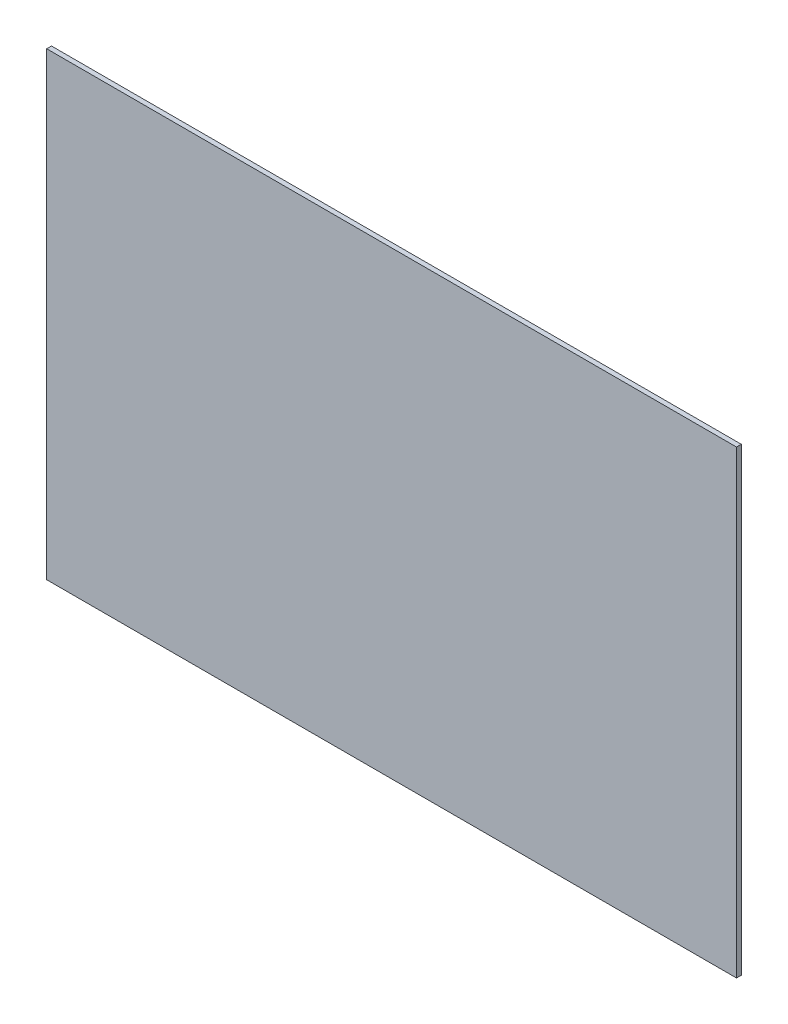
ISO-10303-21;
HEADER;
FILE_DESCRIPTION(('STEP AP214'),'2;1');
FILE_NAME('part.step','',(''),(''),'','','');
FILE_SCHEMA(('AUTOMOTIVE_DESIGN { 1 0 10303 214 1 1 1 1 }'));
ENDSEC;
DATA;
#1=APPLICATION_CONTEXT('core data for automotive mechanical design processes');
#2=APPLICATION_PROTOCOL_DEFINITION('international standard','automotive_design',2000,#1);
#3=PRODUCT_CONTEXT('',#1,'mechanical');
#4=PRODUCT('Part','Part','',(#3));
#5=PRODUCT_RELATED_PRODUCT_CATEGORY('part','',(#4));
#6=PRODUCT_DEFINITION_FORMATION('','',#4);
#7=PRODUCT_DEFINITION_CONTEXT('part definition',#1,'design');
#8=PRODUCT_DEFINITION('design','',#6,#7);
#9=PRODUCT_DEFINITION_SHAPE('','',#8);
#10=(LENGTH_UNIT() NAMED_UNIT(*) SI_UNIT(.MILLI.,.METRE.));
#11=(NAMED_UNIT(*) PLANE_ANGLE_UNIT() SI_UNIT($,.RADIAN.));
#12=(NAMED_UNIT(*) SI_UNIT($,.STERADIAN.) SOLID_ANGLE_UNIT());
#13=UNCERTAINTY_MEASURE_WITH_UNIT(LENGTH_MEASURE(1.E-05),#10,'distance_accuracy_value','');
#14=(GEOMETRIC_REPRESENTATION_CONTEXT(3) GLOBAL_UNCERTAINTY_ASSIGNED_CONTEXT((#13)) GLOBAL_UNIT_ASSIGNED_CONTEXT((#10,
#11,#12)) REPRESENTATION_CONTEXT('',''));
#15=CARTESIAN_POINT('',(0.,0.,0.));
#16=DIRECTION('',(0.,0.,1.));
#17=DIRECTION('',(1.,0.,0.));
#18=AXIS2_PLACEMENT_3D('',#15,#16,#17);
#19=CARTESIAN_POINT('',(457.2,304.8,6.35));
#20=DIRECTION('',(-1.,0.,0.));
#21=DIRECTION('',(0.,-1.,0.));
#22=AXIS2_PLACEMENT_3D('',#19,#20,#21);
#23=PLANE('',#22);
#24=DIRECTION('',(0.,1.,0.));
#25=VECTOR('',#24,1.);
#26=CARTESIAN_POINT('',(457.2,304.8,0.));
#27=LINE('',#26,#25);
#28=CARTESIAN_POINT('',(457.2,-304.8,0.));
#29=VERTEX_POINT('',#28);
#30=CARTESIAN_POINT('',(457.2,304.8,0.));
#31=VERTEX_POINT('',#30);
#32=EDGE_CURVE('E102',#29,#31,#27,.T.);
#33=ORIENTED_EDGE('',*,*,#32,.T.);
#34=DIRECTION('',(0.,0.,-1.));
#35=VECTOR('',#34,1.);
#36=CARTESIAN_POINT('',(457.2,304.8,6.35));
#37=LINE('',#36,#35);
#38=CARTESIAN_POINT('',(457.2,304.8,6.35));
#39=VERTEX_POINT('',#38);
#40=EDGE_CURVE('E11',#39,#31,#37,.T.);
#41=ORIENTED_EDGE('',*,*,#40,.F.);
#42=DIRECTION('',(0.,1.,0.));
#43=VECTOR('',#42,1.);
#44=CARTESIAN_POINT('',(457.2,304.8,6.35));
#45=LINE('',#44,#43);
#46=CARTESIAN_POINT('',(457.2,-304.8,6.35));
#47=VERTEX_POINT('',#46);
#48=EDGE_CURVE('E90',#47,#39,#45,.T.);
#49=ORIENTED_EDGE('',*,*,#48,.F.);
#50=DIRECTION('',(0.,0.,-1.));
#51=VECTOR('',#50,1.);
#52=CARTESIAN_POINT('',(457.2,-304.8,6.35));
#53=LINE('',#52,#51);
#54=EDGE_CURVE('E98',#47,#29,#53,.T.);
#55=ORIENTED_EDGE('',*,*,#54,.T.);
#56=EDGE_LOOP('',(#33,#41,#49,#55));
#57=FACE_BOUND('',#56,.T.);
#58=ADVANCED_FACE('F39',(#57),#23,.F.);
#59=CARTESIAN_POINT('',(-457.2,304.8,6.35));
#60=DIRECTION('',(0.,-1.,0.));
#61=DIRECTION('',(0.,0.,-1.));
#62=AXIS2_PLACEMENT_3D('',#59,#60,#61);
#63=PLANE('',#62);
#64=DIRECTION('',(-1.,0.,0.));
#65=VECTOR('',#64,1.);
#66=CARTESIAN_POINT('',(-457.2,304.8,0.));
#67=LINE('',#66,#65);
#68=CARTESIAN_POINT('',(-457.2,304.8,0.));
#69=VERTEX_POINT('',#68);
#70=EDGE_CURVE('E94',#31,#69,#67,.T.);
#71=ORIENTED_EDGE('',*,*,#70,.T.);
#72=DIRECTION('',(0.,0.,-1.));
#73=VECTOR('',#72,1.);
#74=CARTESIAN_POINT('',(-457.2,304.8,6.35));
#75=LINE('',#74,#73);
#76=CARTESIAN_POINT('',(-457.2,304.8,6.35));
#77=VERTEX_POINT('',#76);
#78=EDGE_CURVE('E47',#77,#69,#75,.T.);
#79=ORIENTED_EDGE('',*,*,#78,.F.);
#80=DIRECTION('',(-1.,0.,0.));
#81=VECTOR('',#80,1.);
#82=CARTESIAN_POINT('',(-457.2,304.8,6.35));
#83=LINE('',#82,#81);
#84=EDGE_CURVE('E85',#39,#77,#83,.T.);
#85=ORIENTED_EDGE('',*,*,#84,.F.);
#86=ORIENTED_EDGE('',*,*,#40,.T.);
#87=EDGE_LOOP('',(#71,#79,#85,#86));
#88=FACE_BOUND('',#87,.T.);
#89=ADVANCED_FACE('F93',(#88),#63,.F.);
#90=CARTESIAN_POINT('',(-457.2,304.8,6.35));
#91=DIRECTION('',(1.,0.,0.));
#92=DIRECTION('',(0.,1.,0.));
#93=AXIS2_PLACEMENT_3D('',#90,#91,#92);
#94=PLANE('',#93);
#95=DIRECTION('',(0.,-1.,0.));
#96=VECTOR('',#95,1.);
#97=CARTESIAN_POINT('',(-457.2,304.8,0.));
#98=LINE('',#97,#96);
#99=CARTESIAN_POINT('',(-457.2,-304.8,0.));
#100=VERTEX_POINT('',#99);
#101=EDGE_CURVE('E72',#69,#100,#98,.T.);
#102=ORIENTED_EDGE('',*,*,#101,.T.);
#103=DIRECTION('',(0.,0.,-1.));
#104=VECTOR('',#103,1.);
#105=CARTESIAN_POINT('',(-457.2,-304.8,6.35));
#106=LINE('',#105,#104);
#107=CARTESIAN_POINT('',(-457.2,-304.8,6.35));
#108=VERTEX_POINT('',#107);
#109=EDGE_CURVE('E95',#108,#100,#106,.T.);
#110=ORIENTED_EDGE('',*,*,#109,.F.);
#111=DIRECTION('',(0.,-1.,0.));
#112=VECTOR('',#111,1.);
#113=CARTESIAN_POINT('',(-457.2,304.8,6.35));
#114=LINE('',#113,#112);
#115=EDGE_CURVE('E88',#77,#108,#114,.T.);
#116=ORIENTED_EDGE('',*,*,#115,.F.);
#117=ORIENTED_EDGE('',*,*,#78,.T.);
#118=EDGE_LOOP('',(#102,#110,#116,#117));
#119=FACE_BOUND('',#118,.T.);
#120=ADVANCED_FACE('F96',(#119),#94,.F.);
#121=CARTESIAN_POINT('',(-457.2,-304.8,6.35));
#122=DIRECTION('',(0.,1.,0.));
#123=DIRECTION('',(0.,0.,1.));
#124=AXIS2_PLACEMENT_3D('',#121,#122,#123);
#125=PLANE('',#124);
#126=DIRECTION('',(1.,0.,0.));
#127=VECTOR('',#126,1.);
#128=CARTESIAN_POINT('',(-457.2,-304.8,0.));
#129=LINE('',#128,#127);
#130=EDGE_CURVE('E78',#100,#29,#129,.T.);
#131=ORIENTED_EDGE('',*,*,#130,.T.);
#132=ORIENTED_EDGE('',*,*,#54,.F.);
#133=DIRECTION('',(1.,0.,0.));
#134=VECTOR('',#133,1.);
#135=CARTESIAN_POINT('',(-457.2,-304.8,6.35));
#136=LINE('',#135,#134);
#137=EDGE_CURVE('E55',#108,#47,#136,.T.);
#138=ORIENTED_EDGE('',*,*,#137,.F.);
#139=ORIENTED_EDGE('',*,*,#109,.T.);
#140=EDGE_LOOP('',(#131,#132,#138,#139));
#141=FACE_BOUND('',#140,.T.);
#142=ADVANCED_FACE('F109',(#141),#125,.F.);
#143=CARTESIAN_POINT('',(0.,0.,6.35));
#144=DIRECTION('',(0.,0.,1.));
#145=DIRECTION('',(1.,0.,0.));
#146=AXIS2_PLACEMENT_3D('',#143,#144,#145);
#147=PLANE('',#146);
#148=ORIENTED_EDGE('',*,*,#48,.T.);
#149=ORIENTED_EDGE('',*,*,#84,.T.);
#150=ORIENTED_EDGE('',*,*,#115,.T.);
#151=ORIENTED_EDGE('',*,*,#137,.T.);
#152=EDGE_LOOP('',(#148,#149,#150,#151));
#153=FACE_BOUND('',#152,.T.);
#154=ADVANCED_FACE('F86',(#153),#147,.T.);
#155=CARTESIAN_POINT('',(0.,0.,0.));
#156=DIRECTION('',(0.,0.,1.));
#157=DIRECTION('',(1.,0.,0.));
#158=AXIS2_PLACEMENT_3D('',#155,#156,#157);
#159=PLANE('',#158);
#160=ORIENTED_EDGE('',*,*,#32,.F.);
#161=ORIENTED_EDGE('',*,*,#130,.F.);
#162=ORIENTED_EDGE('',*,*,#101,.F.);
#163=ORIENTED_EDGE('',*,*,#70,.F.);
#164=EDGE_LOOP('',(#160,#161,#162,#163));
#165=FACE_BOUND('',#164,.T.);
#166=ADVANCED_FACE('F112',(#165),#159,.F.);
#167=CLOSED_SHELL('',(#58,#89,#120,#142,#154,#166));
#168=MANIFOLD_SOLID_BREP('B2',#167);
#169=ADVANCED_BREP_SHAPE_REPRESENTATION('',(#18,#168),#14);
#170=SHAPE_DEFINITION_REPRESENTATION(#9,#169);
ENDSEC;
END-ISO-10303-21;
